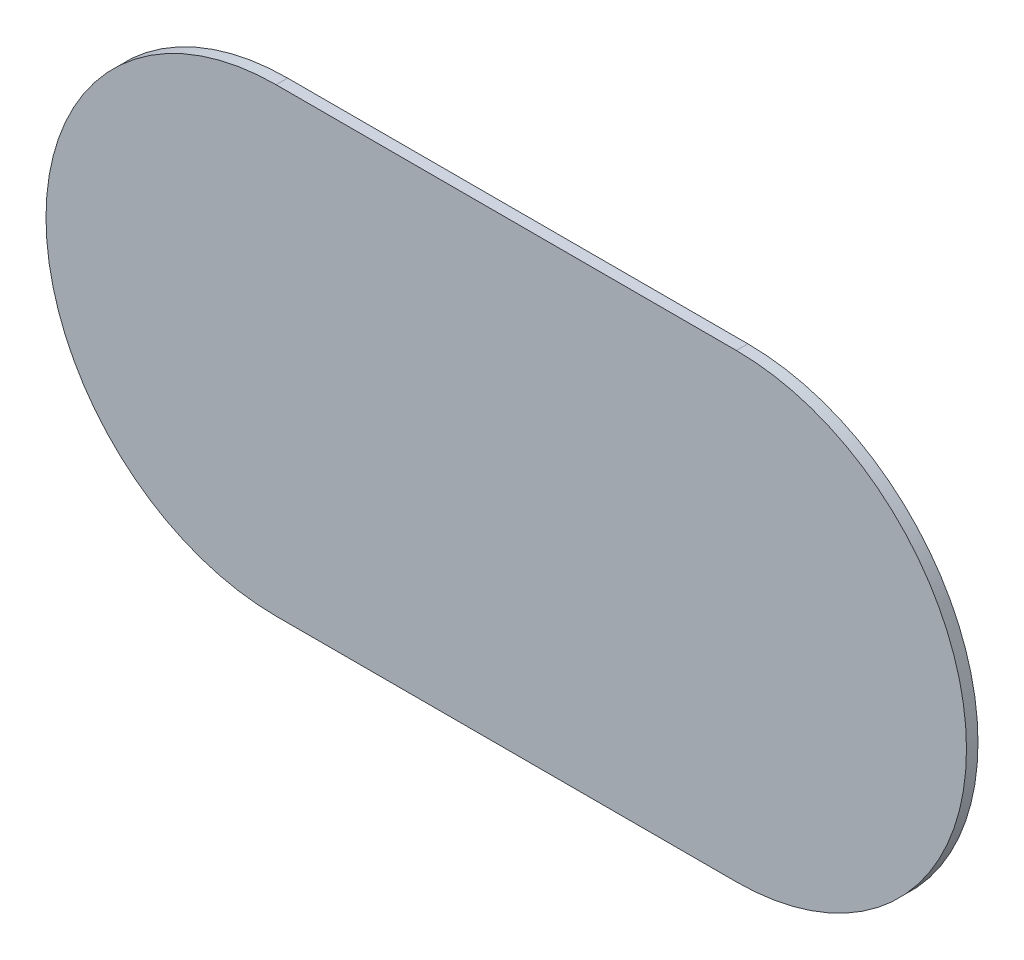
ISO-10303-21;
HEADER;
FILE_DESCRIPTION(('STEP AP214'),'2;1');
FILE_NAME('part.step','',(''),(''),'','','');
FILE_SCHEMA(('AUTOMOTIVE_DESIGN { 1 0 10303 214 1 1 1 1 }'));
ENDSEC;
DATA;
#1=APPLICATION_CONTEXT('core data for automotive mechanical design processes');
#2=APPLICATION_PROTOCOL_DEFINITION('international standard','automotive_design',2000,#1);
#3=PRODUCT_CONTEXT('',#1,'mechanical');
#4=PRODUCT('Part','Part','',(#3));
#5=PRODUCT_RELATED_PRODUCT_CATEGORY('part','',(#4));
#6=PRODUCT_DEFINITION_FORMATION('','',#4);
#7=PRODUCT_DEFINITION_CONTEXT('part definition',#1,'design');
#8=PRODUCT_DEFINITION('design','',#6,#7);
#9=PRODUCT_DEFINITION_SHAPE('','',#8);
#10=(LENGTH_UNIT() NAMED_UNIT(*) SI_UNIT(.MILLI.,.METRE.));
#11=(NAMED_UNIT(*) PLANE_ANGLE_UNIT() SI_UNIT($,.RADIAN.));
#12=(NAMED_UNIT(*) SI_UNIT($,.STERADIAN.) SOLID_ANGLE_UNIT());
#13=UNCERTAINTY_MEASURE_WITH_UNIT(LENGTH_MEASURE(1.E-05),#10,'distance_accuracy_value','');
#14=(GEOMETRIC_REPRESENTATION_CONTEXT(3) GLOBAL_UNCERTAINTY_ASSIGNED_CONTEXT((#13)) GLOBAL_UNIT_ASSIGNED_CONTEXT((#10,
#11,#12)) REPRESENTATION_CONTEXT('',''));
#15=CARTESIAN_POINT('',(0.,0.,0.));
#16=DIRECTION('',(0.,0.,1.));
#17=DIRECTION('',(1.,0.,0.));
#18=AXIS2_PLACEMENT_3D('',#15,#16,#17);
#19=CARTESIAN_POINT('',(-32.5,-6.35,0.));
#20=DIRECTION('',(0.,0.,1.));
#21=DIRECTION('',(1.,0.,0.));
#22=AXIS2_PLACEMENT_3D('',#19,#20,#21);
#23=PLANE('',#22);
#24=CARTESIAN_POINT('',(-33.5,-6.35,0.));
#25=DIRECTION('',(0.,0.,-1.));
#26=DIRECTION('',(-1.,0.,0.));
#27=AXIS2_PLACEMENT_3D('',#24,#25,#26);
#28=CIRCLE('',#27,1.);
#29=CARTESIAN_POINT('',(-33.5,-7.35,0.));
#30=VERTEX_POINT('',#29);
#31=CARTESIAN_POINT('',(-33.5,-5.35,0.));
#32=VERTEX_POINT('',#31);
#33=EDGE_CURVE('E74',#30,#32,#28,.T.);
#34=ORIENTED_EDGE('',*,*,#33,.F.);
#35=DIRECTION('',(1.,0.,0.));
#36=VECTOR('',#35,1.);
#37=CARTESIAN_POINT('',(-33.5,-7.35,0.));
#38=LINE('',#37,#36);
#39=CARTESIAN_POINT('',(-31.5,-7.35,0.));
#40=VERTEX_POINT('',#39);
#41=EDGE_CURVE('E67',#30,#40,#38,.T.);
#42=ORIENTED_EDGE('',*,*,#41,.T.);
#43=CARTESIAN_POINT('',(-31.5,-6.35,0.));
#44=DIRECTION('',(0.,0.,-1.));
#45=DIRECTION('',(-1.,0.,0.));
#46=AXIS2_PLACEMENT_3D('',#43,#44,#45);
#47=CIRCLE('',#46,1.);
#48=CARTESIAN_POINT('',(-31.5,-5.35,0.));
#49=VERTEX_POINT('',#48);
#50=EDGE_CURVE('E20',#49,#40,#47,.T.);
#51=ORIENTED_EDGE('',*,*,#50,.F.);
#52=DIRECTION('',(1.,0.,0.));
#53=VECTOR('',#52,1.);
#54=CARTESIAN_POINT('',(-33.5,-5.35,0.));
#55=LINE('',#54,#53);
#56=EDGE_CURVE('E55',#32,#49,#55,.T.);
#57=ORIENTED_EDGE('',*,*,#56,.F.);
#58=EDGE_LOOP('',(#34,#42,#51,#57));
#59=FACE_BOUND('',#58,.T.);
#60=ADVANCED_FACE('F17',(#59),#23,.T.);
#61=CARTESIAN_POINT('',(-31.5,-6.35,-0.05));
#62=DIRECTION('',(0.,0.,-1.));
#63=DIRECTION('',(-1.,0.,0.));
#64=AXIS2_PLACEMENT_3D('',#61,#62,#63);
#65=CYLINDRICAL_SURFACE('',#64,1.);
#66=ORIENTED_EDGE('',*,*,#50,.T.);
#67=DIRECTION('',(0.,0.,1.));
#68=VECTOR('',#67,1.);
#69=CARTESIAN_POINT('',(-31.5,-7.35,-0.05));
#70=LINE('',#69,#68);
#71=CARTESIAN_POINT('',(-31.5,-7.35,-0.05));
#72=VERTEX_POINT('',#71);
#73=EDGE_CURVE('E79',#40,#72,#70,.F.);
#74=ORIENTED_EDGE('',*,*,#73,.T.);
#75=CARTESIAN_POINT('',(-31.5,-6.35,-0.05));
#76=DIRECTION('',(0.,0.,-1.));
#77=DIRECTION('',(-1.,0.,0.));
#78=AXIS2_PLACEMENT_3D('',#75,#76,#77);
#79=CIRCLE('',#78,1.);
#80=CARTESIAN_POINT('',(-31.5,-5.35,-0.05));
#81=VERTEX_POINT('',#80);
#82=EDGE_CURVE('E73',#72,#81,#79,.F.);
#83=ORIENTED_EDGE('',*,*,#82,.T.);
#84=DIRECTION('',(0.,0.,1.));
#85=VECTOR('',#84,1.);
#86=CARTESIAN_POINT('',(-31.5,-5.35,-0.05));
#87=LINE('',#86,#85);
#88=EDGE_CURVE('E60',#49,#81,#87,.F.);
#89=ORIENTED_EDGE('',*,*,#88,.F.);
#90=EDGE_LOOP('',(#66,#74,#83,#89));
#91=FACE_BOUND('',#90,.T.);
#92=ADVANCED_FACE('F72',(#91),#65,.T.);
#93=CARTESIAN_POINT('',(-33.5,-5.35,-0.05));
#94=DIRECTION('',(0.,1.,0.));
#95=DIRECTION('',(0.,0.,1.));
#96=AXIS2_PLACEMENT_3D('',#93,#94,#95);
#97=PLANE('',#96);
#98=ORIENTED_EDGE('',*,*,#88,.T.);
#99=DIRECTION('',(1.,0.,0.));
#100=VECTOR('',#99,1.);
#101=CARTESIAN_POINT('',(-32.5,-5.35,-0.05));
#102=LINE('',#101,#100);
#103=CARTESIAN_POINT('',(-33.5,-5.35,-0.05));
#104=VERTEX_POINT('',#103);
#105=EDGE_CURVE('E83',#81,#104,#102,.F.);
#106=ORIENTED_EDGE('',*,*,#105,.T.);
#107=DIRECTION('',(0.,0.,-1.));
#108=VECTOR('',#107,1.);
#109=CARTESIAN_POINT('',(-33.5,-5.35,-0.05));
#110=LINE('',#109,#108);
#111=EDGE_CURVE('E62',#32,#104,#110,.T.);
#112=ORIENTED_EDGE('',*,*,#111,.F.);
#113=ORIENTED_EDGE('',*,*,#56,.T.);
#114=EDGE_LOOP('',(#98,#106,#112,#113));
#115=FACE_BOUND('',#114,.T.);
#116=ADVANCED_FACE('F57',(#115),#97,.T.);
#117=CARTESIAN_POINT('',(-33.5,-6.35,-0.05));
#118=DIRECTION('',(0.,0.,-1.));
#119=DIRECTION('',(-1.,0.,0.));
#120=AXIS2_PLACEMENT_3D('',#117,#118,#119);
#121=CYLINDRICAL_SURFACE('',#120,1.);
#122=ORIENTED_EDGE('',*,*,#33,.T.);
#123=ORIENTED_EDGE('',*,*,#111,.T.);
#124=CARTESIAN_POINT('',(-33.5,-6.35,-0.05));
#125=DIRECTION('',(0.,0.,-1.));
#126=DIRECTION('',(-1.,0.,0.));
#127=AXIS2_PLACEMENT_3D('',#124,#125,#126);
#128=CIRCLE('',#127,1.);
#129=CARTESIAN_POINT('',(-33.5,-7.35,-0.05));
#130=VERTEX_POINT('',#129);
#131=EDGE_CURVE('E26',#104,#130,#128,.F.);
#132=ORIENTED_EDGE('',*,*,#131,.T.);
#133=DIRECTION('',(0.,0.,1.));
#134=VECTOR('',#133,1.);
#135=CARTESIAN_POINT('',(-33.5,-7.35,-0.05));
#136=LINE('',#135,#134);
#137=EDGE_CURVE('E34',#130,#30,#136,.T.);
#138=ORIENTED_EDGE('',*,*,#137,.T.);
#139=EDGE_LOOP('',(#122,#123,#132,#138));
#140=FACE_BOUND('',#139,.T.);
#141=ADVANCED_FACE('F88',(#140),#121,.T.);
#142=CARTESIAN_POINT('',(-33.5,-7.35,-0.05));
#143=DIRECTION('',(0.,1.,0.));
#144=DIRECTION('',(0.,0.,1.));
#145=AXIS2_PLACEMENT_3D('',#142,#143,#144);
#146=PLANE('',#145);
#147=ORIENTED_EDGE('',*,*,#73,.F.);
#148=ORIENTED_EDGE('',*,*,#41,.F.);
#149=ORIENTED_EDGE('',*,*,#137,.F.);
#150=DIRECTION('',(1.,0.,0.));
#151=VECTOR('',#150,1.);
#152=CARTESIAN_POINT('',(-32.5,-7.35,-0.05));
#153=LINE('',#152,#151);
#154=EDGE_CURVE('E11',#130,#72,#153,.T.);
#155=ORIENTED_EDGE('',*,*,#154,.T.);
#156=EDGE_LOOP('',(#147,#148,#149,#155));
#157=FACE_BOUND('',#156,.T.);
#158=ADVANCED_FACE('F91',(#157),#146,.F.);
#159=CARTESIAN_POINT('',(-32.5,-6.35,-0.05));
#160=DIRECTION('',(0.,0.,1.));
#161=DIRECTION('',(1.,0.,0.));
#162=AXIS2_PLACEMENT_3D('',#159,#160,#161);
#163=PLANE('',#162);
#164=ORIENTED_EDGE('',*,*,#131,.F.);
#165=ORIENTED_EDGE('',*,*,#105,.F.);
#166=ORIENTED_EDGE('',*,*,#82,.F.);
#167=ORIENTED_EDGE('',*,*,#154,.F.);
#168=EDGE_LOOP('',(#164,#165,#166,#167));
#169=FACE_BOUND('',#168,.T.);
#170=ADVANCED_FACE('F90',(#169),#163,.F.);
#171=CLOSED_SHELL('',(#60,#92,#116,#141,#158,#170));
#172=MANIFOLD_SOLID_BREP('B1',#171);
#173=ADVANCED_BREP_SHAPE_REPRESENTATION('',(#18,#172),#14);
#174=SHAPE_DEFINITION_REPRESENTATION(#9,#173);
ENDSEC;
END-ISO-10303-21;
